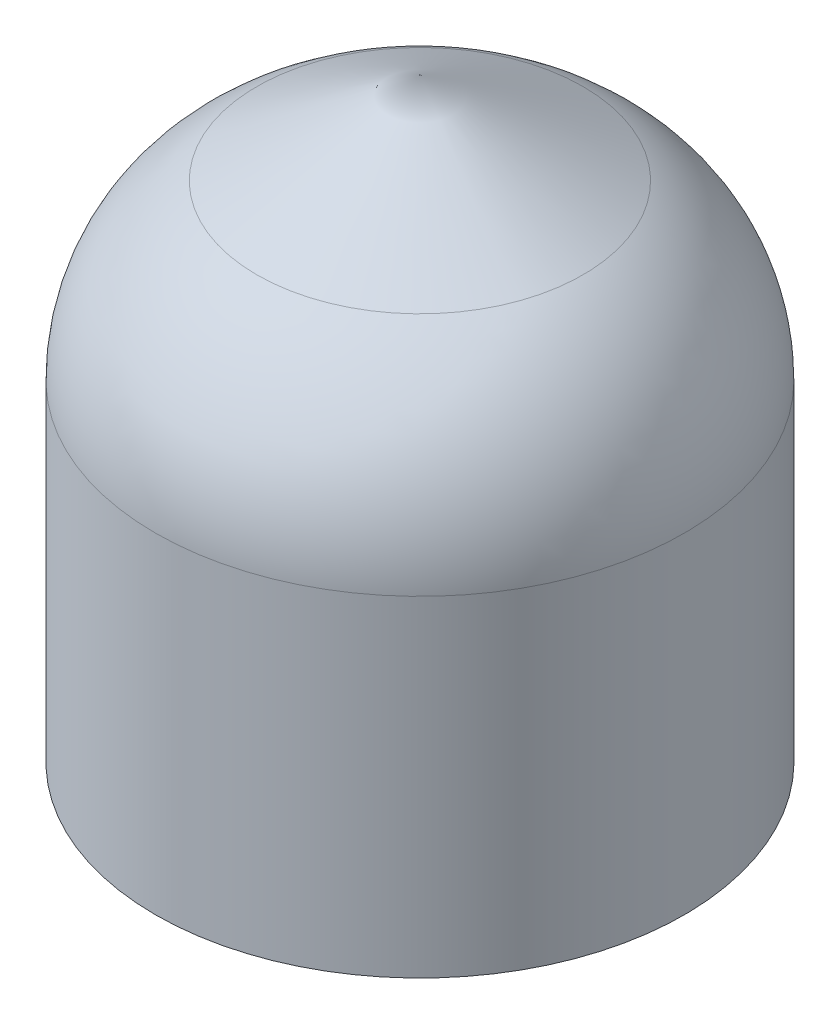
ISO-10303-21;
HEADER;
FILE_DESCRIPTION(('STEP AP214'),'2;1');
FILE_NAME('part.step','',(''),(''),'','','');
FILE_SCHEMA(('AUTOMOTIVE_DESIGN { 1 0 10303 214 1 1 1 1 }'));
ENDSEC;
DATA;
#1=APPLICATION_CONTEXT('core data for automotive mechanical design processes');
#2=APPLICATION_PROTOCOL_DEFINITION('international standard','automotive_design',2000,#1);
#3=PRODUCT_CONTEXT('',#1,'mechanical');
#4=PRODUCT('Part','Part','',(#3));
#5=PRODUCT_RELATED_PRODUCT_CATEGORY('part','',(#4));
#6=PRODUCT_DEFINITION_FORMATION('','',#4);
#7=PRODUCT_DEFINITION_CONTEXT('part definition',#1,'design');
#8=PRODUCT_DEFINITION('design','',#6,#7);
#9=PRODUCT_DEFINITION_SHAPE('','',#8);
#10=(LENGTH_UNIT() NAMED_UNIT(*) SI_UNIT(.MILLI.,.METRE.));
#11=(NAMED_UNIT(*) PLANE_ANGLE_UNIT() SI_UNIT($,.RADIAN.));
#12=(NAMED_UNIT(*) SI_UNIT($,.STERADIAN.) SOLID_ANGLE_UNIT());
#13=UNCERTAINTY_MEASURE_WITH_UNIT(LENGTH_MEASURE(1.E-05),#10,'distance_accuracy_value','');
#14=(GEOMETRIC_REPRESENTATION_CONTEXT(3) GLOBAL_UNCERTAINTY_ASSIGNED_CONTEXT((#13)) GLOBAL_UNIT_ASSIGNED_CONTEXT((#10,
#11,#12)) REPRESENTATION_CONTEXT('',''));
#15=CARTESIAN_POINT('',(0.,0.,0.));
#16=DIRECTION('',(0.,0.,1.));
#17=DIRECTION('',(1.,0.,0.));
#18=AXIS2_PLACEMENT_3D('',#15,#16,#17);
#19=CARTESIAN_POINT('',(0.,5.66176470588235,0.));
#20=DIRECTION('',(0.,1.,0.));
#21=DIRECTION('',(0.,0.,1.));
#22=AXIS2_PLACEMENT_3D('',#19,#20,#21);
#23=CYLINDRICAL_SURFACE('',#22,2.5);
#24=CARTESIAN_POINT('',(0.,7.,0.));
#25=DIRECTION('',(0.,1.,0.));
#26=DIRECTION('',(0.,0.,1.));
#27=AXIS2_PLACEMENT_3D('',#24,#25,#26);
#28=CIRCLE('',#27,2.5);
#29=CARTESIAN_POINT('',(0.,7.,2.5));
#30=VERTEX_POINT('',#29);
#31=EDGE_CURVE('E67',#30,#30,#28,.T.);
#32=ORIENTED_EDGE('',*,*,#31,.T.);
#33=EDGE_LOOP('',(#32));
#34=FACE_BOUND('',#33,.T.);
#35=CARTESIAN_POINT('',(0.,0.,0.));
#36=DIRECTION('',(0.,1.,0.));
#37=DIRECTION('',(0.,0.,1.));
#38=AXIS2_PLACEMENT_3D('',#35,#36,#37);
#39=CIRCLE('',#38,2.5);
#40=CARTESIAN_POINT('',(0.,0.,2.5));
#41=VERTEX_POINT('',#40);
#42=EDGE_CURVE('E11',#41,#41,#39,.T.);
#43=ORIENTED_EDGE('',*,*,#42,.F.);
#44=EDGE_LOOP('',(#43));
#45=FACE_BOUND('',#44,.T.);
#46=ADVANCED_FACE('F32',(#34,#45),#23,.F.);
#47=CARTESIAN_POINT('',(-2.5,0.,0.));
#48=DIRECTION('',(0.,-1.,0.));
#49=DIRECTION('',(0.,0.,-1.));
#50=AXIS2_PLACEMENT_3D('',#47,#48,#49);
#51=PLANE('',#50);
#52=ORIENTED_EDGE('',*,*,#42,.T.);
#53=EDGE_LOOP('',(#52));
#54=FACE_BOUND('',#53,.T.);
#55=CARTESIAN_POINT('',(0.,0.,0.));
#56=DIRECTION('',(0.,1.,0.));
#57=DIRECTION('',(0.,0.,1.));
#58=AXIS2_PLACEMENT_3D('',#55,#56,#57);
#59=CIRCLE('',#58,4.);
#60=CARTESIAN_POINT('',(0.,0.,4.));
#61=VERTEX_POINT('',#60);
#62=EDGE_CURVE('E38',#61,#61,#59,.T.);
#63=ORIENTED_EDGE('',*,*,#62,.F.);
#64=EDGE_LOOP('',(#63));
#65=FACE_BOUND('',#64,.T.);
#66=ADVANCED_FACE('F58',(#54,#65),#51,.T.);
#67=CARTESIAN_POINT('',(0.,5.66176470588235,0.));
#68=DIRECTION('',(0.,1.,0.));
#69=DIRECTION('',(0.,0.,1.));
#70=AXIS2_PLACEMENT_3D('',#67,#68,#69);
#71=CYLINDRICAL_SURFACE('',#70,4.);
#72=ORIENTED_EDGE('',*,*,#62,.T.);
#73=EDGE_LOOP('',(#72));
#74=FACE_BOUND('',#73,.T.);
#75=CARTESIAN_POINT('',(0.,5.,0.));
#76=DIRECTION('',(0.,1.,0.));
#77=DIRECTION('',(0.,0.,1.));
#78=AXIS2_PLACEMENT_3D('',#75,#76,#77);
#79=CIRCLE('',#78,4.);
#80=CARTESIAN_POINT('',(0.,5.,4.));
#81=VERTEX_POINT('',#80);
#82=EDGE_CURVE('E73',#81,#81,#79,.T.);
#83=ORIENTED_EDGE('',*,*,#82,.F.);
#84=EDGE_LOOP('',(#83));
#85=FACE_BOUND('',#84,.T.);
#86=ADVANCED_FACE('F53',(#74,#85),#71,.T.);
#87=CARTESIAN_POINT('',(0.,5.,0.));
#88=DIRECTION('',(0.,1.,0.));
#89=DIRECTION('',(0.,0.,1.));
#90=AXIS2_PLACEMENT_3D('',#87,#88,#89);
#91=DEGENERATE_TOROIDAL_SURFACE('',#90,0.999999999999999,3.,.T.);
#92=ORIENTED_EDGE('',*,*,#82,.T.);
#93=EDGE_LOOP('',(#92));
#94=FACE_BOUND('',#93,.T.);
#95=CARTESIAN_POINT('',(0.,7.61678125730815,0.));
#96=DIRECTION('',(0.,1.,0.));
#97=DIRECTION('',(0.,0.,1.));
#98=AXIS2_PLACEMENT_3D('',#95,#96,#97);
#99=CIRCLE('',#98,2.4671250292326);
#100=CARTESIAN_POINT('',(0.,7.61678125730815,2.4671250292326));
#101=VERTEX_POINT('',#100);
#102=EDGE_CURVE('E75',#101,#101,#99,.T.);
#103=ORIENTED_EDGE('',*,*,#102,.F.);
#104=EDGE_LOOP('',(#103));
#105=FACE_BOUND('',#104,.T.);
#106=ADVANCED_FACE('F44',(#94,#105),#91,.T.);
#107=CARTESIAN_POINT('',(0.,9.,0.));
#108=DIRECTION('',(0.,-1.,0.));
#109=DIRECTION('',(0.,0.,-1.));
#110=AXIS2_PLACEMENT_3D('',#107,#108,#109);
#111=CONICAL_SURFACE('',#110,0.,1.05980557949785);
#112=ORIENTED_EDGE('',*,*,#102,.T.);
#113=EDGE_LOOP('',(#112));
#114=FACE_BOUND('',#113,.T.);
#115=CARTESIAN_POINT('',(0.,9.,0.));
#116=VERTEX_POINT('',#115);
#117=VERTEX_LOOP('',#116);
#118=FACE_BOUND('',#117,.T.);
#119=ADVANCED_FACE('F41',(#114,#118),#111,.T.);
#120=CARTESIAN_POINT('',(0.,7.,0.));
#121=DIRECTION('',(0.,-1.,0.));
#122=DIRECTION('',(0.,0.,-1.));
#123=AXIS2_PLACEMENT_3D('',#120,#121,#122);
#124=PLANE('',#123);
#125=ORIENTED_EDGE('',*,*,#31,.F.);
#126=EDGE_LOOP('',(#125));
#127=FACE_BOUND('',#126,.T.);
#128=ADVANCED_FACE('F43',(#127),#124,.T.);
#129=CLOSED_SHELL('',(#46,#66,#86,#106,#119,#128));
#130=MANIFOLD_SOLID_BREP('B2',#129);
#131=ADVANCED_BREP_SHAPE_REPRESENTATION('',(#18,#130),#14);
#132=SHAPE_DEFINITION_REPRESENTATION(#9,#131);
ENDSEC;
END-ISO-10303-21;
